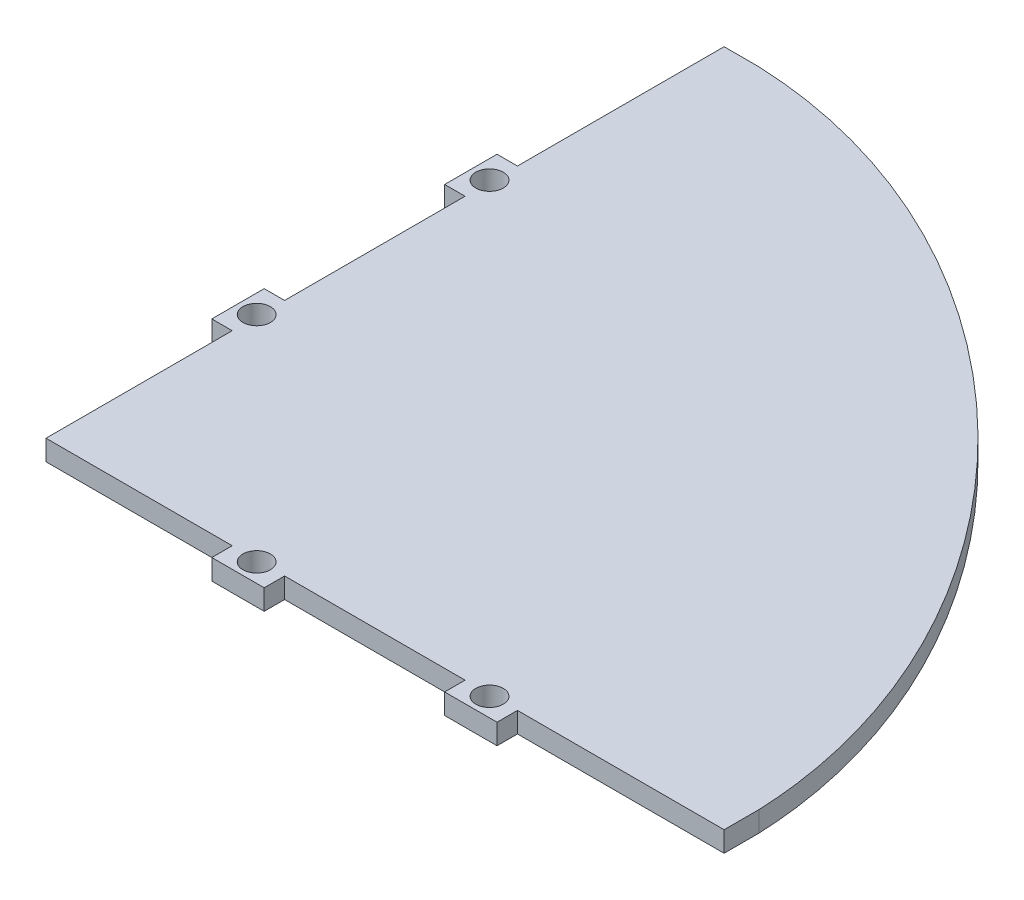
ISO-10303-21;
HEADER;
FILE_DESCRIPTION(('STEP AP214'),'2;1');
FILE_NAME('part.step','',(''),(''),'','','');
FILE_SCHEMA(('AUTOMOTIVE_DESIGN { 1 0 10303 214 1 1 1 1 }'));
ENDSEC;
DATA;
#1=APPLICATION_CONTEXT('core data for automotive mechanical design processes');
#2=APPLICATION_PROTOCOL_DEFINITION('international standard','automotive_design',2000,#1);
#3=PRODUCT_CONTEXT('',#1,'mechanical');
#4=PRODUCT('Part','Part','',(#3));
#5=PRODUCT_RELATED_PRODUCT_CATEGORY('part','',(#4));
#6=PRODUCT_DEFINITION_FORMATION('','',#4);
#7=PRODUCT_DEFINITION_CONTEXT('part definition',#1,'design');
#8=PRODUCT_DEFINITION('design','',#6,#7);
#9=PRODUCT_DEFINITION_SHAPE('','',#8);
#10=(LENGTH_UNIT() NAMED_UNIT(*) SI_UNIT(.MILLI.,.METRE.));
#11=(NAMED_UNIT(*) PLANE_ANGLE_UNIT() SI_UNIT($,.RADIAN.));
#12=(NAMED_UNIT(*) SI_UNIT($,.STERADIAN.) SOLID_ANGLE_UNIT());
#13=UNCERTAINTY_MEASURE_WITH_UNIT(LENGTH_MEASURE(1.E-05),#10,'distance_accuracy_value','');
#14=(GEOMETRIC_REPRESENTATION_CONTEXT(3) GLOBAL_UNCERTAINTY_ASSIGNED_CONTEXT((#13)) GLOBAL_UNIT_ASSIGNED_CONTEXT((#10,
#11,#12)) REPRESENTATION_CONTEXT('',''));
#15=CARTESIAN_POINT('',(0.,0.,0.));
#16=DIRECTION('',(0.,0.,1.));
#17=DIRECTION('',(1.,0.,0.));
#18=AXIS2_PLACEMENT_3D('',#15,#16,#17);
#19=CARTESIAN_POINT('',(0.,2.9718,0.));
#20=DIRECTION('',(-1.,0.,0.));
#21=DIRECTION('',(0.,0.,1.));
#22=AXIS2_PLACEMENT_3D('',#19,#20,#21);
#23=PLANE('',#22);
#24=DIRECTION('',(0.,0.,-1.));
#25=VECTOR('',#24,1.);
#26=CARTESIAN_POINT('',(0.,0.,0.));
#27=LINE('',#26,#25);
#28=CARTESIAN_POINT('',(0.,0.,-68.5715333333333));
#29=VERTEX_POINT('',#28);
#30=CARTESIAN_POINT('',(0.,0.,-98.6282));
#31=VERTEX_POINT('',#30);
#32=EDGE_CURVE('E309',#29,#31,#27,.T.);
#33=ORIENTED_EDGE('',*,*,#32,.F.);
#34=DIRECTION('',(0.,-1.,0.));
#35=VECTOR('',#34,1.);
#36=CARTESIAN_POINT('',(0.,2.9718,-68.5715333333333));
#37=LINE('',#36,#35);
#38=CARTESIAN_POINT('',(0.,2.9718,-68.5715333333333));
#39=VERTEX_POINT('',#38);
#40=EDGE_CURVE('E11',#39,#29,#37,.T.);
#41=ORIENTED_EDGE('',*,*,#40,.F.);
#42=DIRECTION('',(0.,0.,-1.));
#43=VECTOR('',#42,1.);
#44=CARTESIAN_POINT('',(0.,2.9718,0.));
#45=LINE('',#44,#43);
#46=CARTESIAN_POINT('',(0.,2.9718,-98.6282));
#47=VERTEX_POINT('',#46);
#48=EDGE_CURVE('E375',#39,#47,#45,.T.);
#49=ORIENTED_EDGE('',*,*,#48,.T.);
#50=DIRECTION('',(0.,-1.,0.));
#51=VECTOR('',#50,1.);
#52=CARTESIAN_POINT('',(0.,2.9718,-98.6282));
#53=LINE('',#52,#51);
#54=EDGE_CURVE('E56',#47,#31,#53,.T.);
#55=ORIENTED_EDGE('',*,*,#54,.T.);
#56=EDGE_LOOP('',(#33,#41,#49,#55));
#57=FACE_BOUND('',#56,.T.);
#58=ADVANCED_FACE('F39',(#57),#23,.T.);
#59=CARTESIAN_POINT('',(0.,2.9718,-68.5715333333333));
#60=DIRECTION('',(0.,0.,1.));
#61=DIRECTION('',(1.,0.,0.));
#62=AXIS2_PLACEMENT_3D('',#59,#60,#61);
#63=PLANE('',#62);
#64=DIRECTION('',(-1.,0.,0.));
#65=VECTOR('',#64,1.);
#66=CARTESIAN_POINT('',(0.,0.,-68.5715333333333));
#67=LINE('',#66,#65);
#68=CARTESIAN_POINT('',(-2.9718,0.,-68.5715333333333));
#69=VERTEX_POINT('',#68);
#70=EDGE_CURVE('E317',#29,#69,#67,.T.);
#71=ORIENTED_EDGE('',*,*,#70,.T.);
#72=DIRECTION('',(0.,-1.,0.));
#73=VECTOR('',#72,1.);
#74=CARTESIAN_POINT('',(-2.9718,2.9718,-68.5715333333333));
#75=LINE('',#74,#73);
#76=CARTESIAN_POINT('',(-2.9718,2.9718,-68.5715333333333));
#77=VERTEX_POINT('',#76);
#78=EDGE_CURVE('E48',#77,#69,#75,.T.);
#79=ORIENTED_EDGE('',*,*,#78,.F.);
#80=DIRECTION('',(-1.,0.,0.));
#81=VECTOR('',#80,1.);
#82=CARTESIAN_POINT('',(0.,2.9718,-68.5715333333333));
#83=LINE('',#82,#81);
#84=EDGE_CURVE('E419',#39,#77,#83,.T.);
#85=ORIENTED_EDGE('',*,*,#84,.F.);
#86=ORIENTED_EDGE('',*,*,#40,.T.);
#87=EDGE_LOOP('',(#71,#79,#85,#86));
#88=FACE_BOUND('',#87,.T.);
#89=ADVANCED_FACE('F41',(#88),#63,.F.);
#90=CARTESIAN_POINT('',(-2.97179999999996,2.9718,0.));
#91=DIRECTION('',(1.,0.,0.));
#92=DIRECTION('',(0.,0.,-1.));
#93=AXIS2_PLACEMENT_3D('',#90,#91,#92);
#94=PLANE('',#93);
#95=DIRECTION('',(0.,0.,1.));
#96=VECTOR('',#95,1.);
#97=CARTESIAN_POINT('',(-2.97179999999996,0.,0.));
#98=LINE('',#97,#96);
#99=CARTESIAN_POINT('',(-2.9718,0.,-60.9515333333334));
#100=VERTEX_POINT('',#99);
#101=EDGE_CURVE('E313',#69,#100,#98,.T.);
#102=ORIENTED_EDGE('',*,*,#101,.T.);
#103=DIRECTION('',(0.,-1.,0.));
#104=VECTOR('',#103,1.);
#105=CARTESIAN_POINT('',(-2.9718,2.9718,-60.9515333333334));
#106=LINE('',#105,#104);
#107=CARTESIAN_POINT('',(-2.9718,2.9718,-60.9515333333334));
#108=VERTEX_POINT('',#107);
#109=EDGE_CURVE('E407',#108,#100,#106,.T.);
#110=ORIENTED_EDGE('',*,*,#109,.F.);
#111=DIRECTION('',(0.,0.,1.));
#112=VECTOR('',#111,1.);
#113=CARTESIAN_POINT('',(-2.97179999999996,2.9718,0.));
#114=LINE('',#113,#112);
#115=EDGE_CURVE('E414',#77,#108,#114,.T.);
#116=ORIENTED_EDGE('',*,*,#115,.F.);
#117=ORIENTED_EDGE('',*,*,#78,.T.);
#118=EDGE_LOOP('',(#102,#110,#116,#117));
#119=FACE_BOUND('',#118,.T.);
#120=ADVANCED_FACE('F279',(#119),#94,.F.);
#121=CARTESIAN_POINT('',(0.,2.9718,-60.9515333333334));
#122=DIRECTION('',(0.,0.,-1.));
#123=DIRECTION('',(-1.,0.,0.));
#124=AXIS2_PLACEMENT_3D('',#121,#122,#123);
#125=PLANE('',#124);
#126=DIRECTION('',(1.,0.,0.));
#127=VECTOR('',#126,1.);
#128=CARTESIAN_POINT('',(0.,0.,-60.9515333333334));
#129=LINE('',#128,#127);
#130=CARTESIAN_POINT('',(0.,0.,-60.9515333333334));
#131=VERTEX_POINT('',#130);
#132=EDGE_CURVE('E307',#100,#131,#129,.T.);
#133=ORIENTED_EDGE('',*,*,#132,.T.);
#134=DIRECTION('',(0.,-1.,0.));
#135=VECTOR('',#134,1.);
#136=CARTESIAN_POINT('',(0.,2.9718,-60.9515333333334));
#137=LINE('',#136,#135);
#138=CARTESIAN_POINT('',(0.,2.9718,-60.9515333333334));
#139=VERTEX_POINT('',#138);
#140=EDGE_CURVE('E301',#139,#131,#137,.T.);
#141=ORIENTED_EDGE('',*,*,#140,.F.);
#142=DIRECTION('',(1.,0.,0.));
#143=VECTOR('',#142,1.);
#144=CARTESIAN_POINT('',(0.,2.9718,-60.9515333333334));
#145=LINE('',#144,#143);
#146=EDGE_CURVE('E428',#108,#139,#145,.T.);
#147=ORIENTED_EDGE('',*,*,#146,.F.);
#148=ORIENTED_EDGE('',*,*,#109,.T.);
#149=EDGE_LOOP('',(#133,#141,#147,#148));
#150=FACE_BOUND('',#149,.T.);
#151=ADVANCED_FACE('F277',(#150),#125,.F.);
#152=CARTESIAN_POINT('',(0.,0.,-34.7048666666667));
#153=VERTEX_POINT('',#152);
#154=EDGE_CURVE('E296',#153,#131,#27,.T.);
#155=ORIENTED_EDGE('',*,*,#154,.F.);
#156=DIRECTION('',(0.,-1.,0.));
#157=VECTOR('',#156,1.);
#158=CARTESIAN_POINT('',(0.,2.9718,-34.7048666666667));
#159=LINE('',#158,#157);
#160=CARTESIAN_POINT('',(0.,2.9718,-34.7048666666667));
#161=VERTEX_POINT('',#160);
#162=EDGE_CURVE('E298',#161,#153,#159,.T.);
#163=ORIENTED_EDGE('',*,*,#162,.F.);
#164=EDGE_CURVE('E423',#161,#139,#45,.T.);
#165=ORIENTED_EDGE('',*,*,#164,.T.);
#166=ORIENTED_EDGE('',*,*,#140,.T.);
#167=EDGE_LOOP('',(#155,#163,#165,#166));
#168=FACE_BOUND('',#167,.T.);
#169=ADVANCED_FACE('F265',(#168),#23,.T.);
#170=CARTESIAN_POINT('',(0.,2.9718,-34.7048666666667));
#171=DIRECTION('',(0.,0.,1.));
#172=DIRECTION('',(1.,0.,0.));
#173=AXIS2_PLACEMENT_3D('',#170,#171,#172);
#174=PLANE('',#173);
#175=DIRECTION('',(-1.,0.,0.));
#176=VECTOR('',#175,1.);
#177=CARTESIAN_POINT('',(0.,0.,-34.7048666666667));
#178=LINE('',#177,#176);
#179=CARTESIAN_POINT('',(-2.9718,0.,-34.7048666666667));
#180=VERTEX_POINT('',#179);
#181=EDGE_CURVE('E306',#153,#180,#178,.T.);
#182=ORIENTED_EDGE('',*,*,#181,.T.);
#183=DIRECTION('',(0.,-1.,0.));
#184=VECTOR('',#183,1.);
#185=CARTESIAN_POINT('',(-2.9718,2.9718,-34.7048666666667));
#186=LINE('',#185,#184);
#187=CARTESIAN_POINT('',(-2.9718,2.9718,-34.7048666666667));
#188=VERTEX_POINT('',#187);
#189=EDGE_CURVE('E402',#188,#180,#186,.T.);
#190=ORIENTED_EDGE('',*,*,#189,.F.);
#191=DIRECTION('',(-1.,0.,0.));
#192=VECTOR('',#191,1.);
#193=CARTESIAN_POINT('',(0.,2.9718,-34.7048666666667));
#194=LINE('',#193,#192);
#195=EDGE_CURVE('E427',#161,#188,#194,.T.);
#196=ORIENTED_EDGE('',*,*,#195,.F.);
#197=ORIENTED_EDGE('',*,*,#162,.T.);
#198=EDGE_LOOP('',(#182,#190,#196,#197));
#199=FACE_BOUND('',#198,.T.);
#200=ADVANCED_FACE('F272',(#199),#174,.F.);
#201=CARTESIAN_POINT('',(-2.9718,2.9718,0.));
#202=DIRECTION('',(1.,0.,0.));
#203=DIRECTION('',(0.,0.,-1.));
#204=AXIS2_PLACEMENT_3D('',#201,#202,#203);
#205=PLANE('',#204);
#206=DIRECTION('',(0.,0.,1.));
#207=VECTOR('',#206,1.);
#208=CARTESIAN_POINT('',(-2.9718,0.,0.));
#209=LINE('',#208,#207);
#210=CARTESIAN_POINT('',(-2.9718,0.,-27.0848666666667));
#211=VERTEX_POINT('',#210);
#212=EDGE_CURVE('E311',#180,#211,#209,.T.);
#213=ORIENTED_EDGE('',*,*,#212,.T.);
#214=DIRECTION('',(0.,-1.,0.));
#215=VECTOR('',#214,1.);
#216=CARTESIAN_POINT('',(-2.9718,2.9718,-27.0848666666667));
#217=LINE('',#216,#215);
#218=CARTESIAN_POINT('',(-2.9718,2.9718,-27.0848666666667));
#219=VERTEX_POINT('',#218);
#220=EDGE_CURVE('E400',#219,#211,#217,.T.);
#221=ORIENTED_EDGE('',*,*,#220,.F.);
#222=DIRECTION('',(0.,0.,1.));
#223=VECTOR('',#222,1.);
#224=CARTESIAN_POINT('',(-2.9718,2.9718,0.));
#225=LINE('',#224,#223);
#226=EDGE_CURVE('E430',#188,#219,#225,.T.);
#227=ORIENTED_EDGE('',*,*,#226,.F.);
#228=ORIENTED_EDGE('',*,*,#189,.T.);
#229=EDGE_LOOP('',(#213,#221,#227,#228));
#230=FACE_BOUND('',#229,.T.);
#231=ADVANCED_FACE('F268',(#230),#205,.F.);
#232=CARTESIAN_POINT('',(0.,2.9718,-27.0848666666667));
#233=DIRECTION('',(0.,0.,-1.));
#234=DIRECTION('',(-1.,0.,0.));
#235=AXIS2_PLACEMENT_3D('',#232,#233,#234);
#236=PLANE('',#235);
#237=DIRECTION('',(1.,0.,0.));
#238=VECTOR('',#237,1.);
#239=CARTESIAN_POINT('',(0.,0.,-27.0848666666667));
#240=LINE('',#239,#238);
#241=CARTESIAN_POINT('',(0.,0.,-27.0848666666667));
#242=VERTEX_POINT('',#241);
#243=EDGE_CURVE('E320',#211,#242,#240,.T.);
#244=ORIENTED_EDGE('',*,*,#243,.T.);
#245=DIRECTION('',(0.,-1.,0.));
#246=VECTOR('',#245,1.);
#247=CARTESIAN_POINT('',(0.,2.9718,-27.0848666666667));
#248=LINE('',#247,#246);
#249=CARTESIAN_POINT('',(0.,2.9718,-27.0848666666667));
#250=VERTEX_POINT('',#249);
#251=EDGE_CURVE('E398',#250,#242,#248,.T.);
#252=ORIENTED_EDGE('',*,*,#251,.F.);
#253=DIRECTION('',(1.,0.,0.));
#254=VECTOR('',#253,1.);
#255=CARTESIAN_POINT('',(0.,2.9718,-27.0848666666667));
#256=LINE('',#255,#254);
#257=EDGE_CURVE('E426',#219,#250,#256,.T.);
#258=ORIENTED_EDGE('',*,*,#257,.F.);
#259=ORIENTED_EDGE('',*,*,#220,.T.);
#260=EDGE_LOOP('',(#244,#252,#258,#259));
#261=FACE_BOUND('',#260,.T.);
#262=ADVANCED_FACE('F263',(#261),#236,.F.);
#263=CARTESIAN_POINT('',(0.,0.,0.));
#264=VERTEX_POINT('',#263);
#265=EDGE_CURVE('E310',#264,#242,#27,.T.);
#266=ORIENTED_EDGE('',*,*,#265,.F.);
#267=DIRECTION('',(0.,-1.,0.));
#268=VECTOR('',#267,1.);
#269=CARTESIAN_POINT('',(0.,2.9718,0.));
#270=LINE('',#269,#268);
#271=CARTESIAN_POINT('',(0.,2.9718,0.));
#272=VERTEX_POINT('',#271);
#273=EDGE_CURVE('E396',#272,#264,#270,.T.);
#274=ORIENTED_EDGE('',*,*,#273,.F.);
#275=EDGE_CURVE('E422',#272,#250,#45,.T.);
#276=ORIENTED_EDGE('',*,*,#275,.T.);
#277=ORIENTED_EDGE('',*,*,#251,.T.);
#278=EDGE_LOOP('',(#266,#274,#276,#277));
#279=FACE_BOUND('',#278,.T.);
#280=ADVANCED_FACE('F260',(#279),#23,.T.);
#281=CARTESIAN_POINT('',(0.,2.9718,0.));
#282=DIRECTION('',(0.,0.,-1.));
#283=DIRECTION('',(-1.,0.,0.));
#284=AXIS2_PLACEMENT_3D('',#281,#282,#283);
#285=PLANE('',#284);
#286=DIRECTION('',(1.,0.,0.));
#287=VECTOR('',#286,1.);
#288=CARTESIAN_POINT('',(0.,0.,0.));
#289=LINE('',#288,#287);
#290=CARTESIAN_POINT('',(27.0848666666667,0.,0.));
#291=VERTEX_POINT('',#290);
#292=EDGE_CURVE('E319',#264,#291,#289,.T.);
#293=ORIENTED_EDGE('',*,*,#292,.T.);
#294=DIRECTION('',(0.,-1.,0.));
#295=VECTOR('',#294,1.);
#296=CARTESIAN_POINT('',(27.0848666666667,2.9718,0.));
#297=LINE('',#296,#295);
#298=CARTESIAN_POINT('',(27.0848666666667,2.9718,0.));
#299=VERTEX_POINT('',#298);
#300=EDGE_CURVE('E394',#299,#291,#297,.T.);
#301=ORIENTED_EDGE('',*,*,#300,.F.);
#302=DIRECTION('',(1.,0.,0.));
#303=VECTOR('',#302,1.);
#304=CARTESIAN_POINT('',(0.,2.9718,0.));
#305=LINE('',#304,#303);
#306=EDGE_CURVE('E425',#272,#299,#305,.T.);
#307=ORIENTED_EDGE('',*,*,#306,.F.);
#308=ORIENTED_EDGE('',*,*,#273,.T.);
#309=EDGE_LOOP('',(#293,#301,#307,#308));
#310=FACE_BOUND('',#309,.T.);
#311=ADVANCED_FACE('F235',(#310),#285,.F.);
#312=CARTESIAN_POINT('',(27.0848666666667,2.9718,0.));
#313=DIRECTION('',(-1.,0.,0.));
#314=DIRECTION('',(0.,0.,1.));
#315=AXIS2_PLACEMENT_3D('',#312,#313,#314);
#316=PLANE('',#315);
#317=DIRECTION('',(0.,0.,-1.));
#318=VECTOR('',#317,1.);
#319=CARTESIAN_POINT('',(27.0848666666667,0.,0.));
#320=LINE('',#319,#318);
#321=CARTESIAN_POINT('',(27.0848666666667,0.,2.97179999999999));
#322=VERTEX_POINT('',#321);
#323=EDGE_CURVE('E325',#322,#291,#320,.T.);
#324=ORIENTED_EDGE('',*,*,#323,.F.);
#325=DIRECTION('',(0.,-1.,0.));
#326=VECTOR('',#325,1.);
#327=CARTESIAN_POINT('',(27.0848666666667,2.9718,2.97179999999999));
#328=LINE('',#327,#326);
#329=CARTESIAN_POINT('',(27.0848666666667,2.9718,2.97179999999999));
#330=VERTEX_POINT('',#329);
#331=EDGE_CURVE('E392',#330,#322,#328,.T.);
#332=ORIENTED_EDGE('',*,*,#331,.F.);
#333=DIRECTION('',(0.,0.,-1.));
#334=VECTOR('',#333,1.);
#335=CARTESIAN_POINT('',(27.0848666666667,2.9718,0.));
#336=LINE('',#335,#334);
#337=EDGE_CURVE('E439',#330,#299,#336,.T.);
#338=ORIENTED_EDGE('',*,*,#337,.T.);
#339=ORIENTED_EDGE('',*,*,#300,.T.);
#340=EDGE_LOOP('',(#324,#332,#338,#339));
#341=FACE_BOUND('',#340,.T.);
#342=ADVANCED_FACE('F255',(#341),#316,.T.);
#343=CARTESIAN_POINT('',(0.,2.9718,2.97179999999999));
#344=DIRECTION('',(0.,0.,1.));
#345=DIRECTION('',(1.,0.,0.));
#346=AXIS2_PLACEMENT_3D('',#343,#344,#345);
#347=PLANE('',#346);
#348=DIRECTION('',(-1.,0.,0.));
#349=VECTOR('',#348,1.);
#350=CARTESIAN_POINT('',(0.,0.,2.97179999999999));
#351=LINE('',#350,#349);
#352=CARTESIAN_POINT('',(34.7048666666667,0.,2.97179999999999));
#353=VERTEX_POINT('',#352);
#354=EDGE_CURVE('E337',#353,#322,#351,.T.);
#355=ORIENTED_EDGE('',*,*,#354,.F.);
#356=DIRECTION('',(0.,-1.,0.));
#357=VECTOR('',#356,1.);
#358=CARTESIAN_POINT('',(34.7048666666667,2.9718,2.97179999999999));
#359=LINE('',#358,#357);
#360=CARTESIAN_POINT('',(34.7048666666667,2.9718,2.97179999999999));
#361=VERTEX_POINT('',#360);
#362=EDGE_CURVE('E390',#361,#353,#359,.T.);
#363=ORIENTED_EDGE('',*,*,#362,.F.);
#364=DIRECTION('',(-1.,0.,0.));
#365=VECTOR('',#364,1.);
#366=CARTESIAN_POINT('',(0.,2.9718,2.97179999999999));
#367=LINE('',#366,#365);
#368=EDGE_CURVE('E443',#361,#330,#367,.T.);
#369=ORIENTED_EDGE('',*,*,#368,.T.);
#370=ORIENTED_EDGE('',*,*,#331,.T.);
#371=EDGE_LOOP('',(#355,#363,#369,#370));
#372=FACE_BOUND('',#371,.T.);
#373=ADVANCED_FACE('F251',(#372),#347,.T.);
#374=CARTESIAN_POINT('',(34.7048666666667,2.9718,0.));
#375=DIRECTION('',(1.,0.,0.));
#376=DIRECTION('',(0.,0.,-1.));
#377=AXIS2_PLACEMENT_3D('',#374,#375,#376);
#378=PLANE('',#377);
#379=DIRECTION('',(0.,0.,1.));
#380=VECTOR('',#379,1.);
#381=CARTESIAN_POINT('',(34.7048666666667,0.,0.));
#382=LINE('',#381,#380);
#383=CARTESIAN_POINT('',(34.7048666666667,0.,0.));
#384=VERTEX_POINT('',#383);
#385=EDGE_CURVE('E340',#384,#353,#382,.T.);
#386=ORIENTED_EDGE('',*,*,#385,.F.);
#387=DIRECTION('',(0.,-1.,0.));
#388=VECTOR('',#387,1.);
#389=CARTESIAN_POINT('',(34.7048666666667,2.9718,0.));
#390=LINE('',#389,#388);
#391=CARTESIAN_POINT('',(34.7048666666667,2.9718,0.));
#392=VERTEX_POINT('',#391);
#393=EDGE_CURVE('E388',#392,#384,#390,.T.);
#394=ORIENTED_EDGE('',*,*,#393,.F.);
#395=DIRECTION('',(0.,0.,1.));
#396=VECTOR('',#395,1.);
#397=CARTESIAN_POINT('',(34.7048666666667,2.9718,0.));
#398=LINE('',#397,#396);
#399=EDGE_CURVE('E446',#392,#361,#398,.T.);
#400=ORIENTED_EDGE('',*,*,#399,.T.);
#401=ORIENTED_EDGE('',*,*,#362,.T.);
#402=EDGE_LOOP('',(#386,#394,#400,#401));
#403=FACE_BOUND('',#402,.T.);
#404=ADVANCED_FACE('F248',(#403),#378,.T.);
#405=CARTESIAN_POINT('',(60.9515333333333,0.,0.));
#406=VERTEX_POINT('',#405);
#407=EDGE_CURVE('E328',#384,#406,#289,.T.);
#408=ORIENTED_EDGE('',*,*,#407,.T.);
#409=DIRECTION('',(0.,-1.,0.));
#410=VECTOR('',#409,1.);
#411=CARTESIAN_POINT('',(60.9515333333333,2.9718,0.));
#412=LINE('',#411,#410);
#413=CARTESIAN_POINT('',(60.9515333333333,2.9718,0.));
#414=VERTEX_POINT('',#413);
#415=EDGE_CURVE('E386',#414,#406,#412,.T.);
#416=ORIENTED_EDGE('',*,*,#415,.F.);
#417=EDGE_CURVE('E440',#392,#414,#305,.T.);
#418=ORIENTED_EDGE('',*,*,#417,.F.);
#419=ORIENTED_EDGE('',*,*,#393,.T.);
#420=EDGE_LOOP('',(#408,#416,#418,#419));
#421=FACE_BOUND('',#420,.T.);
#422=ADVANCED_FACE('F236',(#421),#285,.F.);
#423=CARTESIAN_POINT('',(60.9515333333333,2.9718,1.42316516279853E-13));
#424=DIRECTION('',(-1.,0.,0.));
#425=DIRECTION('',(0.,0.,1.));
#426=AXIS2_PLACEMENT_3D('',#423,#424,#425);
#427=PLANE('',#426);
#428=DIRECTION('',(0.,0.,-1.));
#429=VECTOR('',#428,1.);
#430=CARTESIAN_POINT('',(60.9515333333333,0.,1.42316516279853E-13));
#431=LINE('',#430,#429);
#432=CARTESIAN_POINT('',(60.9515333333333,0.,2.97179999999998));
#433=VERTEX_POINT('',#432);
#434=EDGE_CURVE('E343',#433,#406,#431,.T.);
#435=ORIENTED_EDGE('',*,*,#434,.F.);
#436=DIRECTION('',(0.,-1.,0.));
#437=VECTOR('',#436,1.);
#438=CARTESIAN_POINT('',(60.9515333333333,2.9718,2.97179999999998));
#439=LINE('',#438,#437);
#440=CARTESIAN_POINT('',(60.9515333333333,2.9718,2.97179999999998));
#441=VERTEX_POINT('',#440);
#442=EDGE_CURVE('E384',#441,#433,#439,.T.);
#443=ORIENTED_EDGE('',*,*,#442,.F.);
#444=DIRECTION('',(0.,0.,-1.));
#445=VECTOR('',#444,1.);
#446=CARTESIAN_POINT('',(60.9515333333333,2.9718,1.42316516279853E-13));
#447=LINE('',#446,#445);
#448=EDGE_CURVE('E449',#441,#414,#447,.T.);
#449=ORIENTED_EDGE('',*,*,#448,.T.);
#450=ORIENTED_EDGE('',*,*,#415,.T.);
#451=EDGE_LOOP('',(#435,#443,#449,#450));
#452=FACE_BOUND('',#451,.T.);
#453=ADVANCED_FACE('F243',(#452),#427,.T.);
#454=CARTESIAN_POINT('',(0.,2.9718,2.97179999999998));
#455=DIRECTION('',(0.,0.,1.));
#456=DIRECTION('',(1.,0.,0.));
#457=AXIS2_PLACEMENT_3D('',#454,#455,#456);
#458=PLANE('',#457);
#459=DIRECTION('',(-1.,0.,0.));
#460=VECTOR('',#459,1.);
#461=CARTESIAN_POINT('',(0.,0.,2.97179999999998));
#462=LINE('',#461,#460);
#463=CARTESIAN_POINT('',(68.5715333333333,0.,2.97179999999998));
#464=VERTEX_POINT('',#463);
#465=EDGE_CURVE('E346',#464,#433,#462,.T.);
#466=ORIENTED_EDGE('',*,*,#465,.F.);
#467=DIRECTION('',(0.,-1.,0.));
#468=VECTOR('',#467,1.);
#469=CARTESIAN_POINT('',(68.5715333333333,2.9718,2.97179999999998));
#470=LINE('',#469,#468);
#471=CARTESIAN_POINT('',(68.5715333333333,2.9718,2.97179999999998));
#472=VERTEX_POINT('',#471);
#473=EDGE_CURVE('E382',#472,#464,#470,.T.);
#474=ORIENTED_EDGE('',*,*,#473,.F.);
#475=DIRECTION('',(-1.,0.,0.));
#476=VECTOR('',#475,1.);
#477=CARTESIAN_POINT('',(0.,2.9718,2.97179999999998));
#478=LINE('',#477,#476);
#479=EDGE_CURVE('E452',#472,#441,#478,.T.);
#480=ORIENTED_EDGE('',*,*,#479,.T.);
#481=ORIENTED_EDGE('',*,*,#442,.T.);
#482=EDGE_LOOP('',(#466,#474,#480,#481));
#483=FACE_BOUND('',#482,.T.);
#484=ADVANCED_FACE('F239',(#483),#458,.T.);
#485=CARTESIAN_POINT('',(68.5715333333333,2.9718,0.));
#486=DIRECTION('',(1.,0.,0.));
#487=DIRECTION('',(0.,0.,-1.));
#488=AXIS2_PLACEMENT_3D('',#485,#486,#487);
#489=PLANE('',#488);
#490=DIRECTION('',(0.,0.,1.));
#491=VECTOR('',#490,1.);
#492=CARTESIAN_POINT('',(68.5715333333333,0.,0.));
#493=LINE('',#492,#491);
#494=CARTESIAN_POINT('',(68.5715333333333,0.,0.));
#495=VERTEX_POINT('',#494);
#496=EDGE_CURVE('E349',#495,#464,#493,.T.);
#497=ORIENTED_EDGE('',*,*,#496,.F.);
#498=DIRECTION('',(0.,-1.,0.));
#499=VECTOR('',#498,1.);
#500=CARTESIAN_POINT('',(68.5715333333333,2.9718,0.));
#501=LINE('',#500,#499);
#502=CARTESIAN_POINT('',(68.5715333333333,2.9718,0.));
#503=VERTEX_POINT('',#502);
#504=EDGE_CURVE('E380',#503,#495,#501,.T.);
#505=ORIENTED_EDGE('',*,*,#504,.F.);
#506=DIRECTION('',(0.,0.,1.));
#507=VECTOR('',#506,1.);
#508=CARTESIAN_POINT('',(68.5715333333333,2.9718,0.));
#509=LINE('',#508,#507);
#510=EDGE_CURVE('E454',#503,#472,#509,.T.);
#511=ORIENTED_EDGE('',*,*,#510,.T.);
#512=ORIENTED_EDGE('',*,*,#473,.T.);
#513=EDGE_LOOP('',(#497,#505,#511,#512));
#514=FACE_BOUND('',#513,.T.);
#515=ADVANCED_FACE('F233',(#514),#489,.T.);
#516=CARTESIAN_POINT('',(98.6282,0.,0.));
#517=VERTEX_POINT('',#516);
#518=EDGE_CURVE('E327',#495,#517,#289,.T.);
#519=ORIENTED_EDGE('',*,*,#518,.T.);
#520=DIRECTION('',(0.,-1.,0.));
#521=VECTOR('',#520,1.);
#522=CARTESIAN_POINT('',(98.6282,2.9718,0.));
#523=LINE('',#522,#521);
#524=CARTESIAN_POINT('',(98.6282,2.9718,0.));
#525=VERTEX_POINT('',#524);
#526=EDGE_CURVE('E206',#525,#517,#523,.T.);
#527=ORIENTED_EDGE('',*,*,#526,.F.);
#528=EDGE_CURVE('E194',#503,#525,#305,.T.);
#529=ORIENTED_EDGE('',*,*,#528,.F.);
#530=ORIENTED_EDGE('',*,*,#504,.T.);
#531=EDGE_LOOP('',(#519,#527,#529,#530));
#532=FACE_BOUND('',#531,.T.);
#533=ADVANCED_FACE('F230',(#532),#285,.F.);
#534=CARTESIAN_POINT('',(98.6282,2.9718,0.));
#535=DIRECTION('',(-1.,0.,0.));
#536=DIRECTION('',(0.,0.,1.));
#537=AXIS2_PLACEMENT_3D('',#534,#535,#536);
#538=PLANE('',#537);
#539=DIRECTION('',(0.,0.,-1.));
#540=VECTOR('',#539,1.);
#541=CARTESIAN_POINT('',(98.6282,0.,0.));
#542=LINE('',#541,#540);
#543=CARTESIAN_POINT('',(98.6282,0.,-5.08000000000032));
#544=VERTEX_POINT('',#543);
#545=EDGE_CURVE('E203',#517,#544,#542,.T.);
#546=ORIENTED_EDGE('',*,*,#545,.T.);
#547=DIRECTION('',(0.,-1.,0.));
#548=VECTOR('',#547,1.);
#549=CARTESIAN_POINT('',(98.6282,2.9718,-5.08000000000032));
#550=LINE('',#549,#548);
#551=CARTESIAN_POINT('',(98.6282,2.9718,-5.08000000000032));
#552=VERTEX_POINT('',#551);
#553=EDGE_CURVE('E200',#552,#544,#550,.T.);
#554=ORIENTED_EDGE('',*,*,#553,.F.);
#555=DIRECTION('',(0.,0.,-1.));
#556=VECTOR('',#555,1.);
#557=CARTESIAN_POINT('',(98.6282,2.9718,0.));
#558=LINE('',#557,#556);
#559=EDGE_CURVE('E184',#525,#552,#558,.T.);
#560=ORIENTED_EDGE('',*,*,#559,.F.);
#561=ORIENTED_EDGE('',*,*,#526,.T.);
#562=EDGE_LOOP('',(#546,#554,#560,#561));
#563=FACE_BOUND('',#562,.T.);
#564=ADVANCED_FACE('F201',(#563),#538,.F.);
#565=CARTESIAN_POINT('',(0.,2.9718,-98.6282));
#566=CARTESIAN_POINT('',(47.2986153488208,2.9718,-100.571245965776));
#567=CARTESIAN_POINT('',(100.571245965776,2.9718,-47.2986153488207));
#568=CARTESIAN_POINT('',(98.6282,2.9718,0.));
#569=B_SPLINE_CURVE_WITH_KNOTS('',3,(#565,#566,#567,#568),.UNSPECIFIED.,.F.,.F.,(4,4),(0.,1.),.UNSPECIFIED.);
#570=DIRECTION('',(0.,-1.,0.));
#571=VECTOR('',#570,1.);
#572=SURFACE_OF_LINEAR_EXTRUSION('',#569,#571);
#573=CARTESIAN_POINT('',(0.,0.,-98.6282));
#574=CARTESIAN_POINT('',(47.2986153488208,0.,-100.571245965776));
#575=CARTESIAN_POINT('',(100.571245965776,0.,-47.2986153488207));
#576=CARTESIAN_POINT('',(98.6282,0.,0.));
#577=B_SPLINE_CURVE_WITH_KNOTS('',3,(#573,#574,#575,#576),.UNSPECIFIED.,.F.,.F.,(4,4),(0.,1.),.UNSPECIFIED.);
#578=CARTESIAN_POINT('',(5.08000000000105,0.,-98.6282));
#579=VERTEX_POINT('',#578);
#580=EDGE_CURVE('E353',#579,#544,#577,.T.);
#581=ORIENTED_EDGE('',*,*,#580,.F.);
#582=DIRECTION('',(0.,-1.,0.));
#583=VECTOR('',#582,1.);
#584=CARTESIAN_POINT('',(5.08000000000105,2.9718,-98.6282));
#585=LINE('',#584,#583);
#586=CARTESIAN_POINT('',(5.08000000000105,2.9718,-98.6282));
#587=VERTEX_POINT('',#586);
#588=EDGE_CURVE('E120',#587,#579,#585,.T.);
#589=ORIENTED_EDGE('',*,*,#588,.F.);
#590=EDGE_CURVE('E191',#587,#552,#569,.T.);
#591=ORIENTED_EDGE('',*,*,#590,.T.);
#592=ORIENTED_EDGE('',*,*,#553,.T.);
#593=EDGE_LOOP('',(#581,#589,#591,#592));
#594=FACE_BOUND('',#593,.T.);
#595=ADVANCED_FACE('F208',(#594),#572,.T.);
#596=CARTESIAN_POINT('',(64.7615333333333,2.9718,0.25399999999999));
#597=DIRECTION('',(0.,-1.,0.));
#598=DIRECTION('',(0.,0.,-1.));
#599=AXIS2_PLACEMENT_3D('',#596,#597,#598);
#600=CYLINDRICAL_SURFACE('',#599,2.);
#601=CARTESIAN_POINT('',(64.7615333333333,2.9718,0.25399999999999));
#602=DIRECTION('',(0.,1.,0.));
#603=DIRECTION('',(0.,0.,1.));
#604=AXIS2_PLACEMENT_3D('',#601,#602,#603);
#605=CIRCLE('',#604,2.);
#606=CARTESIAN_POINT('',(64.7615333333333,2.9718,2.25399999999999));
#607=VERTEX_POINT('',#606);
#608=EDGE_CURVE('E688',#607,#607,#605,.F.);
#609=ORIENTED_EDGE('',*,*,#608,.F.);
#610=EDGE_LOOP('',(#609));
#611=FACE_BOUND('',#610,.T.);
#612=CARTESIAN_POINT('',(64.7615333333333,0.,0.25399999999999));
#613=DIRECTION('',(0.,1.,0.));
#614=DIRECTION('',(0.,0.,1.));
#615=AXIS2_PLACEMENT_3D('',#612,#613,#614);
#616=CIRCLE('',#615,2.);
#617=CARTESIAN_POINT('',(64.7615333333333,0.,2.25399999999999));
#618=VERTEX_POINT('',#617);
#619=EDGE_CURVE('E369',#618,#618,#616,.F.);
#620=ORIENTED_EDGE('',*,*,#619,.T.);
#621=EDGE_LOOP('',(#620));
#622=FACE_BOUND('',#621,.T.);
#623=ADVANCED_FACE('F225',(#611,#622),#600,.F.);
#624=CARTESIAN_POINT('',(30.8948666666667,2.9718,0.253999999999994));
#625=DIRECTION('',(0.,-1.,0.));
#626=DIRECTION('',(0.,0.,-1.));
#627=AXIS2_PLACEMENT_3D('',#624,#625,#626);
#628=CYLINDRICAL_SURFACE('',#627,2.00000000000001);
#629=CARTESIAN_POINT('',(30.8948666666667,2.9718,0.253999999999994));
#630=DIRECTION('',(0.,1.,0.));
#631=DIRECTION('',(0.,0.,1.));
#632=AXIS2_PLACEMENT_3D('',#629,#630,#631);
#633=CIRCLE('',#632,2.00000000000001);
#634=CARTESIAN_POINT('',(30.8948666666667,2.9718,2.254));
#635=VERTEX_POINT('',#634);
#636=EDGE_CURVE('E695',#635,#635,#633,.F.);
#637=ORIENTED_EDGE('',*,*,#636,.F.);
#638=EDGE_LOOP('',(#637));
#639=FACE_BOUND('',#638,.T.);
#640=CARTESIAN_POINT('',(30.8948666666667,0.,0.253999999999994));
#641=DIRECTION('',(0.,1.,0.));
#642=DIRECTION('',(0.,0.,1.));
#643=AXIS2_PLACEMENT_3D('',#640,#641,#642);
#644=CIRCLE('',#643,2.00000000000001);
#645=CARTESIAN_POINT('',(30.8948666666667,0.,2.254));
#646=VERTEX_POINT('',#645);
#647=EDGE_CURVE('E366',#646,#646,#644,.F.);
#648=ORIENTED_EDGE('',*,*,#647,.T.);
#649=EDGE_LOOP('',(#648));
#650=FACE_BOUND('',#649,.T.);
#651=ADVANCED_FACE('F478',(#639,#650),#628,.F.);
#652=CARTESIAN_POINT('',(-0.254000000000001,2.9718,-64.7615333333333));
#653=DIRECTION('',(0.,-1.,0.));
#654=DIRECTION('',(0.,0.,-1.));
#655=AXIS2_PLACEMENT_3D('',#652,#653,#654);
#656=CYLINDRICAL_SURFACE('',#655,2.00000000000001);
#657=CARTESIAN_POINT('',(-0.254000000000001,2.9718,-64.7615333333333));
#658=DIRECTION('',(0.,1.,0.));
#659=DIRECTION('',(0.,0.,1.));
#660=AXIS2_PLACEMENT_3D('',#657,#658,#659);
#661=CIRCLE('',#660,2.00000000000001);
#662=CARTESIAN_POINT('',(-0.254000000000001,2.9718,-62.7615333333333));
#663=VERTEX_POINT('',#662);
#664=EDGE_CURVE('E211',#663,#663,#661,.T.);
#665=ORIENTED_EDGE('',*,*,#664,.T.);
#666=EDGE_LOOP('',(#665));
#667=FACE_BOUND('',#666,.T.);
#668=CARTESIAN_POINT('',(-0.254000000000001,0.,-64.7615333333333));
#669=DIRECTION('',(0.,1.,0.));
#670=DIRECTION('',(0.,0.,1.));
#671=AXIS2_PLACEMENT_3D('',#668,#669,#670);
#672=CIRCLE('',#671,2.00000000000001);
#673=CARTESIAN_POINT('',(-0.254000000000001,0.,-62.7615333333333));
#674=VERTEX_POINT('',#673);
#675=EDGE_CURVE('E363',#674,#674,#672,.T.);
#676=ORIENTED_EDGE('',*,*,#675,.F.);
#677=EDGE_LOOP('',(#676));
#678=FACE_BOUND('',#677,.T.);
#679=ADVANCED_FACE('F471',(#667,#678),#656,.F.);
#680=CARTESIAN_POINT('',(0.,2.9718,-98.6282));
#681=DIRECTION('',(0.,0.,-1.));
#682=DIRECTION('',(-1.,0.,0.));
#683=AXIS2_PLACEMENT_3D('',#680,#681,#682);
#684=PLANE('',#683);
#685=DIRECTION('',(1.,0.,0.));
#686=VECTOR('',#685,1.);
#687=CARTESIAN_POINT('',(0.,0.,-98.6282));
#688=LINE('',#687,#686);
#689=EDGE_CURVE('E357',#31,#579,#688,.T.);
#690=ORIENTED_EDGE('',*,*,#689,.F.);
#691=ORIENTED_EDGE('',*,*,#54,.F.);
#692=DIRECTION('',(1.,0.,0.));
#693=VECTOR('',#692,1.);
#694=CARTESIAN_POINT('',(0.,2.9718,-98.6282));
#695=LINE('',#694,#693);
#696=EDGE_CURVE('E209',#47,#587,#695,.T.);
#697=ORIENTED_EDGE('',*,*,#696,.T.);
#698=ORIENTED_EDGE('',*,*,#588,.T.);
#699=EDGE_LOOP('',(#690,#691,#697,#698));
#700=FACE_BOUND('',#699,.T.);
#701=ADVANCED_FACE('F226',(#700),#684,.T.);
#702=CARTESIAN_POINT('',(-0.254,2.9718,-30.8948666666667));
#703=DIRECTION('',(0.,-1.,0.));
#704=DIRECTION('',(0.,0.,-1.));
#705=AXIS2_PLACEMENT_3D('',#702,#703,#704);
#706=CYLINDRICAL_SURFACE('',#705,2.);
#707=CARTESIAN_POINT('',(-0.254,2.9718,-30.8948666666667));
#708=DIRECTION('',(0.,1.,0.));
#709=DIRECTION('',(0.,0.,1.));
#710=AXIS2_PLACEMENT_3D('',#707,#708,#709);
#711=CIRCLE('',#710,2.);
#712=CARTESIAN_POINT('',(-0.254,2.9718,-28.8948666666667));
#713=VERTEX_POINT('',#712);
#714=EDGE_CURVE('E377',#713,#713,#711,.T.);
#715=ORIENTED_EDGE('',*,*,#714,.T.);
#716=EDGE_LOOP('',(#715));
#717=FACE_BOUND('',#716,.T.);
#718=CARTESIAN_POINT('',(-0.254,0.,-30.8948666666667));
#719=DIRECTION('',(0.,1.,0.));
#720=DIRECTION('',(0.,0.,1.));
#721=AXIS2_PLACEMENT_3D('',#718,#719,#720);
#722=CIRCLE('',#721,2.);
#723=CARTESIAN_POINT('',(-0.254,0.,-28.8948666666667));
#724=VERTEX_POINT('',#723);
#725=EDGE_CURVE('E372',#724,#724,#722,.T.);
#726=ORIENTED_EDGE('',*,*,#725,.F.);
#727=EDGE_LOOP('',(#726));
#728=FACE_BOUND('',#727,.T.);
#729=ADVANCED_FACE('F470',(#717,#728),#706,.F.);
#730=CARTESIAN_POINT('',(0.,2.9718,0.));
#731=DIRECTION('',(0.,1.,0.));
#732=DIRECTION('',(0.,0.,1.));
#733=AXIS2_PLACEMENT_3D('',#730,#731,#732);
#734=PLANE('',#733);
#735=ORIENTED_EDGE('',*,*,#48,.F.);
#736=ORIENTED_EDGE('',*,*,#84,.T.);
#737=ORIENTED_EDGE('',*,*,#115,.T.);
#738=ORIENTED_EDGE('',*,*,#146,.T.);
#739=ORIENTED_EDGE('',*,*,#164,.F.);
#740=ORIENTED_EDGE('',*,*,#195,.T.);
#741=ORIENTED_EDGE('',*,*,#226,.T.);
#742=ORIENTED_EDGE('',*,*,#257,.T.);
#743=ORIENTED_EDGE('',*,*,#275,.F.);
#744=ORIENTED_EDGE('',*,*,#306,.T.);
#745=ORIENTED_EDGE('',*,*,#337,.F.);
#746=ORIENTED_EDGE('',*,*,#368,.F.);
#747=ORIENTED_EDGE('',*,*,#399,.F.);
#748=ORIENTED_EDGE('',*,*,#417,.T.);
#749=ORIENTED_EDGE('',*,*,#448,.F.);
#750=ORIENTED_EDGE('',*,*,#479,.F.);
#751=ORIENTED_EDGE('',*,*,#510,.F.);
#752=ORIENTED_EDGE('',*,*,#528,.T.);
#753=ORIENTED_EDGE('',*,*,#559,.T.);
#754=ORIENTED_EDGE('',*,*,#590,.F.);
#755=ORIENTED_EDGE('',*,*,#696,.F.);
#756=EDGE_LOOP('',(#735,#736,#737,#738,#739,#740,#741,#742,#743,#744,#745,#746,#747,#748,#749,
#750,#751,#752,#753,#754,#755));
#757=FACE_BOUND('',#756,.T.);
#758=ORIENTED_EDGE('',*,*,#664,.F.);
#759=EDGE_LOOP('',(#758));
#760=FACE_BOUND('',#759,.T.);
#761=ORIENTED_EDGE('',*,*,#636,.T.);
#762=EDGE_LOOP('',(#761));
#763=FACE_BOUND('',#762,.T.);
#764=ORIENTED_EDGE('',*,*,#608,.T.);
#765=EDGE_LOOP('',(#764));
#766=FACE_BOUND('',#765,.T.);
#767=ORIENTED_EDGE('',*,*,#714,.F.);
#768=EDGE_LOOP('',(#767));
#769=FACE_BOUND('',#768,.T.);
#770=ADVANCED_FACE('F187',(#757,#760,#763,#766,#769),#734,.T.);
#771=CARTESIAN_POINT('',(0.,0.,0.));
#772=DIRECTION('',(0.,1.,0.));
#773=DIRECTION('',(0.,0.,1.));
#774=AXIS2_PLACEMENT_3D('',#771,#772,#773);
#775=PLANE('',#774);
#776=ORIENTED_EDGE('',*,*,#32,.T.);
#777=ORIENTED_EDGE('',*,*,#689,.T.);
#778=ORIENTED_EDGE('',*,*,#580,.T.);
#779=ORIENTED_EDGE('',*,*,#545,.F.);
#780=ORIENTED_EDGE('',*,*,#518,.F.);
#781=ORIENTED_EDGE('',*,*,#496,.T.);
#782=ORIENTED_EDGE('',*,*,#465,.T.);
#783=ORIENTED_EDGE('',*,*,#434,.T.);
#784=ORIENTED_EDGE('',*,*,#407,.F.);
#785=ORIENTED_EDGE('',*,*,#385,.T.);
#786=ORIENTED_EDGE('',*,*,#354,.T.);
#787=ORIENTED_EDGE('',*,*,#323,.T.);
#788=ORIENTED_EDGE('',*,*,#292,.F.);
#789=ORIENTED_EDGE('',*,*,#265,.T.);
#790=ORIENTED_EDGE('',*,*,#243,.F.);
#791=ORIENTED_EDGE('',*,*,#212,.F.);
#792=ORIENTED_EDGE('',*,*,#181,.F.);
#793=ORIENTED_EDGE('',*,*,#154,.T.);
#794=ORIENTED_EDGE('',*,*,#132,.F.);
#795=ORIENTED_EDGE('',*,*,#101,.F.);
#796=ORIENTED_EDGE('',*,*,#70,.F.);
#797=EDGE_LOOP('',(#776,#777,#778,#779,#780,#781,#782,#783,#784,#785,#786,#787,#788,#789,#790,
#791,#792,#793,#794,#795,#796));
#798=FACE_BOUND('',#797,.T.);
#799=ORIENTED_EDGE('',*,*,#675,.T.);
#800=EDGE_LOOP('',(#799));
#801=FACE_BOUND('',#800,.T.);
#802=ORIENTED_EDGE('',*,*,#647,.F.);
#803=EDGE_LOOP('',(#802));
#804=FACE_BOUND('',#803,.T.);
#805=ORIENTED_EDGE('',*,*,#619,.F.);
#806=EDGE_LOOP('',(#805));
#807=FACE_BOUND('',#806,.T.);
#808=ORIENTED_EDGE('',*,*,#725,.T.);
#809=EDGE_LOOP('',(#808));
#810=FACE_BOUND('',#809,.T.);
#811=ADVANCED_FACE('F416',(#798,#801,#804,#807,#810),#775,.F.);
#812=CLOSED_SHELL('',(#58,#89,#120,#151,#169,#200,#231,#262,#280,#311,#342,#373,#404,#422,#453,
#484,#515,#533,#564,#595,#623,#651,#679,#701,#729,#770,#811));
#813=MANIFOLD_SOLID_BREP('B2',#812);
#814=ADVANCED_BREP_SHAPE_REPRESENTATION('',(#18,#813),#14);
#815=SHAPE_DEFINITION_REPRESENTATION(#9,#814);
ENDSEC;
END-ISO-10303-21;
